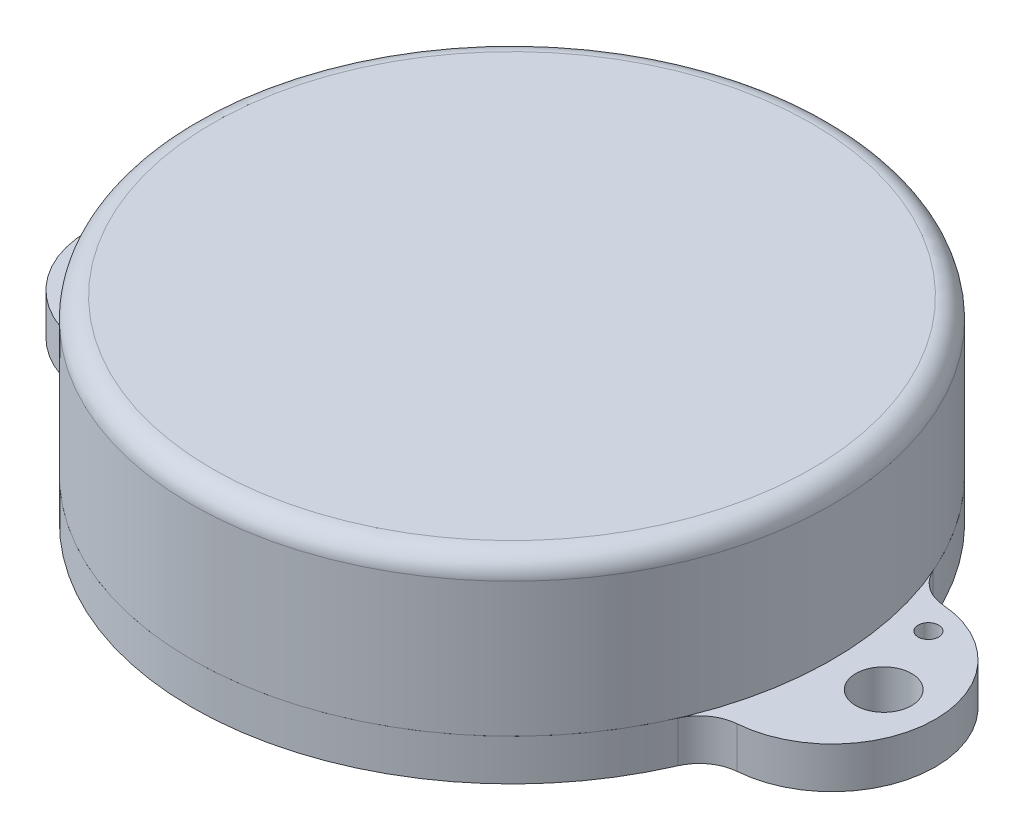
ISO-10303-21;
HEADER;
FILE_DESCRIPTION(('STEP AP214'),'2;1');
FILE_NAME('part.step','',(''),(''),'','','');
FILE_SCHEMA(('AUTOMOTIVE_DESIGN { 1 0 10303 214 1 1 1 1 }'));
ENDSEC;
DATA;
#1=APPLICATION_CONTEXT('core data for automotive mechanical design processes');
#2=APPLICATION_PROTOCOL_DEFINITION('international standard','automotive_design',2000,#1);
#3=PRODUCT_CONTEXT('',#1,'mechanical');
#4=PRODUCT('Part','Part','',(#3));
#5=PRODUCT_RELATED_PRODUCT_CATEGORY('part','',(#4));
#6=PRODUCT_DEFINITION_FORMATION('','',#4);
#7=PRODUCT_DEFINITION_CONTEXT('part definition',#1,'design');
#8=PRODUCT_DEFINITION('design','',#6,#7);
#9=PRODUCT_DEFINITION_SHAPE('','',#8);
#10=(LENGTH_UNIT() NAMED_UNIT(*) SI_UNIT(.MILLI.,.METRE.));
#11=(NAMED_UNIT(*) PLANE_ANGLE_UNIT() SI_UNIT($,.RADIAN.));
#12=(NAMED_UNIT(*) SI_UNIT($,.STERADIAN.) SOLID_ANGLE_UNIT());
#13=UNCERTAINTY_MEASURE_WITH_UNIT(LENGTH_MEASURE(1.E-05),#10,'distance_accuracy_value','');
#14=(GEOMETRIC_REPRESENTATION_CONTEXT(3) GLOBAL_UNCERTAINTY_ASSIGNED_CONTEXT((#13)) GLOBAL_UNIT_ASSIGNED_CONTEXT((#10,
#11,#12)) REPRESENTATION_CONTEXT('',''));
#15=CARTESIAN_POINT('',(0.,0.,0.));
#16=DIRECTION('',(0.,0.,1.));
#17=DIRECTION('',(1.,0.,0.));
#18=AXIS2_PLACEMENT_3D('',#15,#16,#17);
#19=CARTESIAN_POINT('',(0.,9.5,0.));
#20=DIRECTION('',(0.,-1.,0.));
#21=DIRECTION('',(0.,0.,-1.));
#22=AXIS2_PLACEMENT_3D('',#19,#20,#21);
#23=CYLINDRICAL_SURFACE('',#22,15.5);
#24=CARTESIAN_POINT('',(0.,8.5,0.));
#25=DIRECTION('',(0.,1.,0.));
#26=DIRECTION('',(0.,0.,1.));
#27=AXIS2_PLACEMENT_3D('',#24,#25,#26);
#28=CIRCLE('',#27,15.5);
#29=CARTESIAN_POINT('',(0.,8.5,15.5));
#30=VERTEX_POINT('',#29);
#31=EDGE_CURVE('E11',#30,#30,#28,.F.);
#32=ORIENTED_EDGE('',*,*,#31,.T.);
#33=EDGE_LOOP('',(#32));
#34=FACE_BOUND('',#33,.T.);
#35=CARTESIAN_POINT('',(0.,2.,0.));
#36=DIRECTION('',(0.,1.,0.));
#37=DIRECTION('',(0.,0.,1.));
#38=AXIS2_PLACEMENT_3D('',#35,#36,#37);
#39=CIRCLE('',#38,15.5);
#40=CARTESIAN_POINT('',(0.,2.,15.5));
#41=VERTEX_POINT('',#40);
#42=EDGE_CURVE('E53',#41,#41,#39,.T.);
#43=ORIENTED_EDGE('',*,*,#42,.T.);
#44=EDGE_LOOP('',(#43));
#45=FACE_BOUND('',#44,.T.);
#46=ADVANCED_FACE('F42',(#34,#45),#23,.T.);
#47=CARTESIAN_POINT('',(0.,9.5,0.));
#48=DIRECTION('',(0.,1.,0.));
#49=DIRECTION('',(0.,0.,1.));
#50=AXIS2_PLACEMENT_3D('',#47,#48,#49);
#51=PLANE('',#50);
#52=CARTESIAN_POINT('',(0.,9.5,0.));
#53=DIRECTION('',(0.,1.,0.));
#54=DIRECTION('',(0.,0.,1.));
#55=AXIS2_PLACEMENT_3D('',#52,#53,#54);
#56=CIRCLE('',#55,14.5);
#57=CARTESIAN_POINT('',(0.,9.5,14.5));
#58=VERTEX_POINT('',#57);
#59=EDGE_CURVE('E49',#58,#58,#56,.T.);
#60=ORIENTED_EDGE('',*,*,#59,.T.);
#61=EDGE_LOOP('',(#60));
#62=FACE_BOUND('',#61,.T.);
#63=ADVANCED_FACE('F63',(#62),#51,.T.);
#64=CARTESIAN_POINT('',(0.,2.,0.));
#65=DIRECTION('',(0.,1.,0.));
#66=DIRECTION('',(0.,0.,1.));
#67=AXIS2_PLACEMENT_3D('',#64,#65,#66);
#68=PLANE('',#67);
#69=ORIENTED_EDGE('',*,*,#42,.F.);
#70=EDGE_LOOP('',(#69));
#71=FACE_BOUND('',#70,.T.);
#72=ADVANCED_FACE('F61',(#71),#68,.F.);
#73=CARTESIAN_POINT('',(0.,8.5,0.));
#74=DIRECTION('',(0.,1.,0.));
#75=DIRECTION('',(0.,0.,1.));
#76=AXIS2_PLACEMENT_3D('',#73,#74,#75);
#77=TOROIDAL_SURFACE('',#76,14.5,1.);
#78=ORIENTED_EDGE('',*,*,#31,.F.);
#79=EDGE_LOOP('',(#78));
#80=FACE_BOUND('',#79,.T.);
#81=ORIENTED_EDGE('',*,*,#59,.F.);
#82=EDGE_LOOP('',(#81));
#83=FACE_BOUND('',#82,.T.);
#84=ADVANCED_FACE('F44',(#80,#83),#77,.T.);
#85=CLOSED_SHELL('',(#46,#63,#72,#84));
#86=MANIFOLD_SOLID_BREP('B2',#85);
#87=CARTESIAN_POINT('',(-8.0241935483871,2.,3.48924316980386));
#88=DIRECTION('',(0.,-1.,0.));
#89=DIRECTION('',(0.,0.,-1.));
#90=AXIS2_PLACEMENT_3D('',#87,#88,#89);
#91=PLANE('',#90);
#92=CARTESIAN_POINT('',(-16.0483870967742,2.,6.97848633960772));
#93=DIRECTION('',(0.,-1.,0.));
#94=DIRECTION('',(0.,0.,-1.));
#95=AXIS2_PLACEMENT_3D('',#92,#93,#94);
#96=CIRCLE('',#95,2.);
#97=CARTESIAN_POINT('',(-15.8917050691244,2.,4.9846330997198));
#98=VERTEX_POINT('',#97);
#99=CARTESIAN_POINT('',(-14.2142857142857,2.,6.18094504365255));
#100=VERTEX_POINT('',#99);
#101=EDGE_CURVE('E209',#98,#100,#96,.T.);
#102=ORIENTED_EDGE('',*,*,#101,.T.);
#103=CARTESIAN_POINT('',(0.,2.,0.));
#104=DIRECTION('',(0.,1.,0.));
#105=DIRECTION('',(0.,0.,1.));
#106=AXIS2_PLACEMENT_3D('',#103,#104,#105);
#107=CIRCLE('',#106,15.5);
#108=CARTESIAN_POINT('',(14.2142857142857,2.,6.18094504365255));
#109=VERTEX_POINT('',#108);
#110=EDGE_CURVE('E157',#100,#109,#107,.T.);
#111=ORIENTED_EDGE('',*,*,#110,.T.);
#112=CARTESIAN_POINT('',(16.0483870967742,2.,6.97848633960772));
#113=DIRECTION('',(0.,-1.,0.));
#114=DIRECTION('',(0.,0.,1.));
#115=AXIS2_PLACEMENT_3D('',#112,#113,#114);
#116=CIRCLE('',#115,2.);
#117=CARTESIAN_POINT('',(15.8917050691244,2.,4.9846330997198));
#118=VERTEX_POINT('',#117);
#119=EDGE_CURVE('E224',#109,#118,#116,.T.);
#120=ORIENTED_EDGE('',*,*,#119,.T.);
#121=CARTESIAN_POINT('',(15.5,2.,0.));
#122=DIRECTION('',(0.,1.,0.));
#123=DIRECTION('',(0.,0.,1.));
#124=AXIS2_PLACEMENT_3D('',#121,#122,#123);
#125=CIRCLE('',#124,5.);
#126=CARTESIAN_POINT('',(15.8917050691244,2.,-4.9846330997198));
#127=VERTEX_POINT('',#126);
#128=EDGE_CURVE('E237',#118,#127,#125,.T.);
#129=ORIENTED_EDGE('',*,*,#128,.T.);
#130=CARTESIAN_POINT('',(16.0483870967742,2.,-6.97848633960772));
#131=DIRECTION('',(0.,-1.,0.));
#132=DIRECTION('',(0.,0.,-1.));
#133=AXIS2_PLACEMENT_3D('',#130,#131,#132);
#134=CIRCLE('',#133,2.);
#135=CARTESIAN_POINT('',(14.2142857142857,2.,-6.18094504365255));
#136=VERTEX_POINT('',#135);
#137=EDGE_CURVE('E176',#127,#136,#134,.T.);
#138=ORIENTED_EDGE('',*,*,#137,.T.);
#139=CARTESIAN_POINT('',(0.,2.,0.));
#140=DIRECTION('',(0.,1.,0.));
#141=DIRECTION('',(0.,0.,1.));
#142=AXIS2_PLACEMENT_3D('',#139,#140,#141);
#143=CIRCLE('',#142,15.5);
#144=CARTESIAN_POINT('',(-14.2142857142857,2.,-6.18094504365255));
#145=VERTEX_POINT('',#144);
#146=EDGE_CURVE('E170',#136,#145,#143,.T.);
#147=ORIENTED_EDGE('',*,*,#146,.T.);
#148=CARTESIAN_POINT('',(-16.0483870967742,2.,-6.97848633960772));
#149=DIRECTION('',(0.,-1.,0.));
#150=DIRECTION('',(0.,0.,1.));
#151=AXIS2_PLACEMENT_3D('',#148,#149,#150);
#152=CIRCLE('',#151,2.);
#153=CARTESIAN_POINT('',(-15.8917050691244,2.,-4.9846330997198));
#154=VERTEX_POINT('',#153);
#155=EDGE_CURVE('E174',#145,#154,#152,.T.);
#156=ORIENTED_EDGE('',*,*,#155,.T.);
#157=CARTESIAN_POINT('',(-15.5,2.,0.));
#158=DIRECTION('',(0.,1.,0.));
#159=DIRECTION('',(0.,0.,1.));
#160=AXIS2_PLACEMENT_3D('',#157,#158,#159);
#161=CIRCLE('',#160,5.);
#162=EDGE_CURVE('E114',#154,#98,#161,.T.);
#163=ORIENTED_EDGE('',*,*,#162,.T.);
#164=EDGE_LOOP('',(#102,#111,#120,#129,#138,#147,#156,#163));
#165=FACE_BOUND('',#164,.T.);
#166=CARTESIAN_POINT('',(-18.,2.,0.));
#167=DIRECTION('',(0.,1.,0.));
#168=DIRECTION('',(0.,0.,1.));
#169=AXIS2_PLACEMENT_3D('',#166,#167,#168);
#170=CIRCLE('',#169,1.35);
#171=CARTESIAN_POINT('',(-18.,2.,1.35));
#172=VERTEX_POINT('',#171);
#173=EDGE_CURVE('E198',#172,#172,#170,.T.);
#174=ORIENTED_EDGE('',*,*,#173,.F.);
#175=EDGE_LOOP('',(#174));
#176=FACE_BOUND('',#175,.T.);
#177=CARTESIAN_POINT('',(18.,2.,0.));
#178=DIRECTION('',(0.,1.,0.));
#179=DIRECTION('',(0.,0.,1.));
#180=AXIS2_PLACEMENT_3D('',#177,#178,#179);
#181=CIRCLE('',#180,1.35);
#182=CARTESIAN_POINT('',(18.,2.,1.35));
#183=VERTEX_POINT('',#182);
#184=EDGE_CURVE('E246',#183,#183,#181,.T.);
#185=ORIENTED_EDGE('',*,*,#184,.F.);
#186=EDGE_LOOP('',(#185));
#187=FACE_BOUND('',#186,.T.);
#188=CARTESIAN_POINT('',(16.6285092124747,2.,-3.53449874390192));
#189=DIRECTION('',(0.,1.,0.));
#190=DIRECTION('',(0.,0.,1.));
#191=AXIS2_PLACEMENT_3D('',#188,#189,#190);
#192=CIRCLE('',#191,0.499999999999999);
#193=CARTESIAN_POINT('',(16.6285092124747,2.,-3.03449874390192));
#194=VERTEX_POINT('',#193);
#195=EDGE_CURVE('E252',#194,#194,#192,.T.);
#196=ORIENTED_EDGE('',*,*,#195,.F.);
#197=EDGE_LOOP('',(#196));
#198=FACE_BOUND('',#197,.T.);
#199=CARTESIAN_POINT('',(-16.6285092124747,2.,3.53449874390192));
#200=DIRECTION('',(0.,1.,0.));
#201=DIRECTION('',(0.,0.,1.));
#202=AXIS2_PLACEMENT_3D('',#199,#200,#201);
#203=CIRCLE('',#202,0.499999999999999);
#204=CARTESIAN_POINT('',(-16.6285092124747,2.,4.03449874390192));
#205=VERTEX_POINT('',#204);
#206=EDGE_CURVE('E258',#205,#205,#203,.T.);
#207=ORIENTED_EDGE('',*,*,#206,.F.);
#208=EDGE_LOOP('',(#207));
#209=FACE_BOUND('',#208,.T.);
#210=ADVANCED_FACE('F97',(#165,#176,#187,#198,#209),#91,.F.);
#211=CARTESIAN_POINT('',(-8.0241935483871,0.,3.48924316980386));
#212=DIRECTION('',(0.,-1.,0.));
#213=DIRECTION('',(0.,0.,-1.));
#214=AXIS2_PLACEMENT_3D('',#211,#212,#213);
#215=PLANE('',#214);
#216=CARTESIAN_POINT('',(16.6285092124747,0.,-3.53449874390192));
#217=DIRECTION('',(0.,1.,0.));
#218=DIRECTION('',(0.,0.,1.));
#219=AXIS2_PLACEMENT_3D('',#216,#217,#218);
#220=CIRCLE('',#219,0.499999999999999);
#221=CARTESIAN_POINT('',(16.6285092124747,0.,-3.03449874390192));
#222=VERTEX_POINT('',#221);
#223=EDGE_CURVE('E255',#222,#222,#220,.T.);
#224=ORIENTED_EDGE('',*,*,#223,.T.);
#225=EDGE_LOOP('',(#224));
#226=FACE_BOUND('',#225,.T.);
#227=CARTESIAN_POINT('',(-18.,0.,0.));
#228=DIRECTION('',(0.,1.,0.));
#229=DIRECTION('',(0.,0.,1.));
#230=AXIS2_PLACEMENT_3D('',#227,#228,#229);
#231=CIRCLE('',#230,1.35);
#232=CARTESIAN_POINT('',(-18.,0.,1.35));
#233=VERTEX_POINT('',#232);
#234=EDGE_CURVE('E243',#233,#233,#231,.T.);
#235=ORIENTED_EDGE('',*,*,#234,.T.);
#236=EDGE_LOOP('',(#235));
#237=FACE_BOUND('',#236,.T.);
#238=CARTESIAN_POINT('',(-16.0483870967742,0.,6.97848633960772));
#239=DIRECTION('',(0.,-1.,0.));
#240=DIRECTION('',(0.,0.,-1.));
#241=AXIS2_PLACEMENT_3D('',#238,#239,#240);
#242=CIRCLE('',#241,2.);
#243=CARTESIAN_POINT('',(-15.8917050691244,0.,4.9846330997198));
#244=VERTEX_POINT('',#243);
#245=CARTESIAN_POINT('',(-14.2142857142857,0.,6.18094504365255));
#246=VERTEX_POINT('',#245);
#247=EDGE_CURVE('E194',#244,#246,#242,.T.);
#248=ORIENTED_EDGE('',*,*,#247,.F.);
#249=CARTESIAN_POINT('',(-15.5,0.,0.));
#250=DIRECTION('',(0.,1.,0.));
#251=DIRECTION('',(0.,0.,1.));
#252=AXIS2_PLACEMENT_3D('',#249,#250,#251);
#253=CIRCLE('',#252,5.);
#254=CARTESIAN_POINT('',(-15.8917050691244,0.,-4.9846330997198));
#255=VERTEX_POINT('',#254);
#256=EDGE_CURVE('E149',#255,#244,#253,.T.);
#257=ORIENTED_EDGE('',*,*,#256,.F.);
#258=CARTESIAN_POINT('',(-16.0483870967742,0.,-6.97848633960772));
#259=DIRECTION('',(0.,-1.,0.));
#260=DIRECTION('',(0.,0.,1.));
#261=AXIS2_PLACEMENT_3D('',#258,#259,#260);
#262=CIRCLE('',#261,2.);
#263=CARTESIAN_POINT('',(-14.2142857142857,0.,-6.18094504365255));
#264=VERTEX_POINT('',#263);
#265=EDGE_CURVE('E143',#264,#255,#262,.T.);
#266=ORIENTED_EDGE('',*,*,#265,.F.);
#267=CARTESIAN_POINT('',(0.,0.,0.));
#268=DIRECTION('',(0.,1.,0.));
#269=DIRECTION('',(0.,0.,1.));
#270=AXIS2_PLACEMENT_3D('',#267,#268,#269);
#271=CIRCLE('',#270,15.5);
#272=CARTESIAN_POINT('',(14.2142857142857,0.,-6.18094504365255));
#273=VERTEX_POINT('',#272);
#274=EDGE_CURVE('E184',#273,#264,#271,.T.);
#275=ORIENTED_EDGE('',*,*,#274,.F.);
#276=CARTESIAN_POINT('',(16.0483870967742,0.,-6.97848633960772));
#277=DIRECTION('',(0.,-1.,0.));
#278=DIRECTION('',(0.,0.,-1.));
#279=AXIS2_PLACEMENT_3D('',#276,#277,#278);
#280=CIRCLE('',#279,2.);
#281=CARTESIAN_POINT('',(15.8917050691244,0.,-4.9846330997198));
#282=VERTEX_POINT('',#281);
#283=EDGE_CURVE('E204',#282,#273,#280,.T.);
#284=ORIENTED_EDGE('',*,*,#283,.F.);
#285=CARTESIAN_POINT('',(15.5,0.,0.));
#286=DIRECTION('',(0.,1.,0.));
#287=DIRECTION('',(0.,0.,1.));
#288=AXIS2_PLACEMENT_3D('',#285,#286,#287);
#289=CIRCLE('',#288,5.);
#290=CARTESIAN_POINT('',(15.8917050691244,0.,4.9846330997198));
#291=VERTEX_POINT('',#290);
#292=EDGE_CURVE('E202',#291,#282,#289,.T.);
#293=ORIENTED_EDGE('',*,*,#292,.F.);
#294=CARTESIAN_POINT('',(16.0483870967742,0.,6.97848633960772));
#295=DIRECTION('',(0.,-1.,0.));
#296=DIRECTION('',(0.,0.,1.));
#297=AXIS2_PLACEMENT_3D('',#294,#295,#296);
#298=CIRCLE('',#297,2.);
#299=CARTESIAN_POINT('',(14.2142857142857,0.,6.18094504365255));
#300=VERTEX_POINT('',#299);
#301=EDGE_CURVE('E200',#300,#291,#298,.T.);
#302=ORIENTED_EDGE('',*,*,#301,.F.);
#303=CARTESIAN_POINT('',(0.,0.,0.));
#304=DIRECTION('',(0.,1.,0.));
#305=DIRECTION('',(0.,0.,1.));
#306=AXIS2_PLACEMENT_3D('',#303,#304,#305);
#307=CIRCLE('',#306,15.5);
#308=EDGE_CURVE('E197',#246,#300,#307,.T.);
#309=ORIENTED_EDGE('',*,*,#308,.F.);
#310=EDGE_LOOP('',(#248,#257,#266,#275,#284,#293,#302,#309));
#311=FACE_BOUND('',#310,.T.);
#312=CARTESIAN_POINT('',(18.,0.,0.));
#313=DIRECTION('',(0.,1.,0.));
#314=DIRECTION('',(0.,0.,1.));
#315=AXIS2_PLACEMENT_3D('',#312,#313,#314);
#316=CIRCLE('',#315,1.35);
#317=CARTESIAN_POINT('',(18.,0.,1.35));
#318=VERTEX_POINT('',#317);
#319=EDGE_CURVE('E249',#318,#318,#316,.T.);
#320=ORIENTED_EDGE('',*,*,#319,.T.);
#321=EDGE_LOOP('',(#320));
#322=FACE_BOUND('',#321,.T.);
#323=CARTESIAN_POINT('',(-16.6285092124747,0.,3.53449874390192));
#324=DIRECTION('',(0.,1.,0.));
#325=DIRECTION('',(0.,0.,1.));
#326=AXIS2_PLACEMENT_3D('',#323,#324,#325);
#327=CIRCLE('',#326,0.499999999999999);
#328=CARTESIAN_POINT('',(-16.6285092124747,0.,4.03449874390192));
#329=VERTEX_POINT('',#328);
#330=EDGE_CURVE('E261',#329,#329,#327,.T.);
#331=ORIENTED_EDGE('',*,*,#330,.T.);
#332=EDGE_LOOP('',(#331));
#333=FACE_BOUND('',#332,.T.);
#334=ADVANCED_FACE('F228',(#226,#237,#311,#322,#333),#215,.T.);
#335=CARTESIAN_POINT('',(-16.0483870967742,2.,6.97848633960772));
#336=DIRECTION('',(0.,-1.,0.));
#337=DIRECTION('',(0.,0.,-1.));
#338=AXIS2_PLACEMENT_3D('',#335,#336,#337);
#339=CYLINDRICAL_SURFACE('',#338,2.);
#340=ORIENTED_EDGE('',*,*,#247,.T.);
#341=DIRECTION('',(0.,-1.,0.));
#342=VECTOR('',#341,1.);
#343=CARTESIAN_POINT('',(-14.2142857142857,2.,6.18094504365255));
#344=LINE('',#343,#342);
#345=EDGE_CURVE('E40',#100,#246,#344,.T.);
#346=ORIENTED_EDGE('',*,*,#345,.F.);
#347=ORIENTED_EDGE('',*,*,#101,.F.);
#348=DIRECTION('',(0.,-1.,0.));
#349=VECTOR('',#348,1.);
#350=CARTESIAN_POINT('',(-15.8917050691244,2.,4.9846330997198));
#351=LINE('',#350,#349);
#352=EDGE_CURVE('E190',#98,#244,#351,.T.);
#353=ORIENTED_EDGE('',*,*,#352,.T.);
#354=EDGE_LOOP('',(#340,#346,#347,#353));
#355=FACE_BOUND('',#354,.T.);
#356=ADVANCED_FACE('F99',(#355),#339,.F.);
#357=CARTESIAN_POINT('',(0.,2.,0.));
#358=DIRECTION('',(0.,-1.,0.));
#359=DIRECTION('',(0.,0.,-1.));
#360=AXIS2_PLACEMENT_3D('',#357,#358,#359);
#361=CYLINDRICAL_SURFACE('',#360,15.5);
#362=ORIENTED_EDGE('',*,*,#308,.T.);
#363=DIRECTION('',(0.,-1.,0.));
#364=VECTOR('',#363,1.);
#365=CARTESIAN_POINT('',(14.2142857142857,2.,6.18094504365255));
#366=LINE('',#365,#364);
#367=EDGE_CURVE('E106',#109,#300,#366,.T.);
#368=ORIENTED_EDGE('',*,*,#367,.F.);
#369=ORIENTED_EDGE('',*,*,#110,.F.);
#370=ORIENTED_EDGE('',*,*,#345,.T.);
#371=EDGE_LOOP('',(#362,#368,#369,#370));
#372=FACE_BOUND('',#371,.T.);
#373=ADVANCED_FACE('F293',(#372),#361,.T.);
#374=CARTESIAN_POINT('',(16.0483870967742,2.,6.97848633960772));
#375=DIRECTION('',(0.,-1.,0.));
#376=DIRECTION('',(0.,0.,-1.));
#377=AXIS2_PLACEMENT_3D('',#374,#375,#376);
#378=CYLINDRICAL_SURFACE('',#377,2.);
#379=ORIENTED_EDGE('',*,*,#301,.T.);
#380=DIRECTION('',(0.,-1.,0.));
#381=VECTOR('',#380,1.);
#382=CARTESIAN_POINT('',(15.8917050691244,2.,4.9846330997198));
#383=LINE('',#382,#381);
#384=EDGE_CURVE('E216',#118,#291,#383,.T.);
#385=ORIENTED_EDGE('',*,*,#384,.F.);
#386=ORIENTED_EDGE('',*,*,#119,.F.);
#387=ORIENTED_EDGE('',*,*,#367,.T.);
#388=EDGE_LOOP('',(#379,#385,#386,#387));
#389=FACE_BOUND('',#388,.T.);
#390=ADVANCED_FACE('F222',(#389),#378,.F.);
#391=CARTESIAN_POINT('',(15.5,2.,0.));
#392=DIRECTION('',(0.,-1.,0.));
#393=DIRECTION('',(0.,0.,-1.));
#394=AXIS2_PLACEMENT_3D('',#391,#392,#393);
#395=CYLINDRICAL_SURFACE('',#394,5.);
#396=ORIENTED_EDGE('',*,*,#292,.T.);
#397=DIRECTION('',(0.,-1.,0.));
#398=VECTOR('',#397,1.);
#399=CARTESIAN_POINT('',(15.8917050691244,2.,-4.9846330997198));
#400=LINE('',#399,#398);
#401=EDGE_CURVE('E213',#127,#282,#400,.T.);
#402=ORIENTED_EDGE('',*,*,#401,.F.);
#403=ORIENTED_EDGE('',*,*,#128,.F.);
#404=ORIENTED_EDGE('',*,*,#384,.T.);
#405=EDGE_LOOP('',(#396,#402,#403,#404));
#406=FACE_BOUND('',#405,.T.);
#407=ADVANCED_FACE('F233',(#406),#395,.T.);
#408=CARTESIAN_POINT('',(16.0483870967742,2.,-6.97848633960772));
#409=DIRECTION('',(0.,-1.,0.));
#410=DIRECTION('',(0.,0.,-1.));
#411=AXIS2_PLACEMENT_3D('',#408,#409,#410);
#412=CYLINDRICAL_SURFACE('',#411,2.);
#413=ORIENTED_EDGE('',*,*,#283,.T.);
#414=DIRECTION('',(0.,-1.,0.));
#415=VECTOR('',#414,1.);
#416=CARTESIAN_POINT('',(14.2142857142857,2.,-6.18094504365255));
#417=LINE('',#416,#415);
#418=EDGE_CURVE('E185',#136,#273,#417,.T.);
#419=ORIENTED_EDGE('',*,*,#418,.F.);
#420=ORIENTED_EDGE('',*,*,#137,.F.);
#421=ORIENTED_EDGE('',*,*,#401,.T.);
#422=EDGE_LOOP('',(#413,#419,#420,#421));
#423=FACE_BOUND('',#422,.T.);
#424=ADVANCED_FACE('F236',(#423),#412,.F.);
#425=CARTESIAN_POINT('',(0.,2.,0.));
#426=DIRECTION('',(0.,-1.,0.));
#427=DIRECTION('',(0.,0.,-1.));
#428=AXIS2_PLACEMENT_3D('',#425,#426,#427);
#429=CYLINDRICAL_SURFACE('',#428,15.5);
#430=ORIENTED_EDGE('',*,*,#274,.T.);
#431=DIRECTION('',(0.,-1.,0.));
#432=VECTOR('',#431,1.);
#433=CARTESIAN_POINT('',(-14.2142857142857,2.,-6.18094504365255));
#434=LINE('',#433,#432);
#435=EDGE_CURVE('E181',#145,#264,#434,.T.);
#436=ORIENTED_EDGE('',*,*,#435,.F.);
#437=ORIENTED_EDGE('',*,*,#146,.F.);
#438=ORIENTED_EDGE('',*,*,#418,.T.);
#439=EDGE_LOOP('',(#430,#436,#437,#438));
#440=FACE_BOUND('',#439,.T.);
#441=ADVANCED_FACE('F182',(#440),#429,.T.);
#442=CARTESIAN_POINT('',(-16.0483870967742,2.,-6.97848633960772));
#443=DIRECTION('',(0.,-1.,0.));
#444=DIRECTION('',(0.,0.,-1.));
#445=AXIS2_PLACEMENT_3D('',#442,#443,#444);
#446=CYLINDRICAL_SURFACE('',#445,2.);
#447=ORIENTED_EDGE('',*,*,#265,.T.);
#448=DIRECTION('',(0.,-1.,0.));
#449=VECTOR('',#448,1.);
#450=CARTESIAN_POINT('',(-15.8917050691244,2.,-4.9846330997198));
#451=LINE('',#450,#449);
#452=EDGE_CURVE('E186',#154,#255,#451,.T.);
#453=ORIENTED_EDGE('',*,*,#452,.F.);
#454=ORIENTED_EDGE('',*,*,#155,.F.);
#455=ORIENTED_EDGE('',*,*,#435,.T.);
#456=EDGE_LOOP('',(#447,#453,#454,#455));
#457=FACE_BOUND('',#456,.T.);
#458=ADVANCED_FACE('F188',(#457),#446,.F.);
#459=CARTESIAN_POINT('',(-15.5,2.,0.));
#460=DIRECTION('',(0.,-1.,0.));
#461=DIRECTION('',(0.,0.,-1.));
#462=AXIS2_PLACEMENT_3D('',#459,#460,#461);
#463=CYLINDRICAL_SURFACE('',#462,5.);
#464=ORIENTED_EDGE('',*,*,#256,.T.);
#465=ORIENTED_EDGE('',*,*,#352,.F.);
#466=ORIENTED_EDGE('',*,*,#162,.F.);
#467=ORIENTED_EDGE('',*,*,#452,.T.);
#468=EDGE_LOOP('',(#464,#465,#466,#467));
#469=FACE_BOUND('',#468,.T.);
#470=ADVANCED_FACE('F281',(#469),#463,.T.);
#471=CARTESIAN_POINT('',(-18.,2.,0.));
#472=DIRECTION('',(0.,-1.,0.));
#473=DIRECTION('',(0.,0.,-1.));
#474=AXIS2_PLACEMENT_3D('',#471,#472,#473);
#475=CYLINDRICAL_SURFACE('',#474,1.35);
#476=ORIENTED_EDGE('',*,*,#173,.T.);
#477=EDGE_LOOP('',(#476));
#478=FACE_BOUND('',#477,.T.);
#479=ORIENTED_EDGE('',*,*,#234,.F.);
#480=EDGE_LOOP('',(#479));
#481=FACE_BOUND('',#480,.T.);
#482=ADVANCED_FACE('F278',(#478,#481),#475,.F.);
#483=CARTESIAN_POINT('',(18.,2.,0.));
#484=DIRECTION('',(0.,-1.,0.));
#485=DIRECTION('',(0.,0.,-1.));
#486=AXIS2_PLACEMENT_3D('',#483,#484,#485);
#487=CYLINDRICAL_SURFACE('',#486,1.35);
#488=ORIENTED_EDGE('',*,*,#184,.T.);
#489=EDGE_LOOP('',(#488));
#490=FACE_BOUND('',#489,.T.);
#491=ORIENTED_EDGE('',*,*,#319,.F.);
#492=EDGE_LOOP('',(#491));
#493=FACE_BOUND('',#492,.T.);
#494=ADVANCED_FACE('F357',(#490,#493),#487,.F.);
#495=CARTESIAN_POINT('',(16.6285092124747,2.,-3.53449874390192));
#496=DIRECTION('',(0.,-1.,0.));
#497=DIRECTION('',(0.,0.,-1.));
#498=AXIS2_PLACEMENT_3D('',#495,#496,#497);
#499=CYLINDRICAL_SURFACE('',#498,0.499999999999999);
#500=ORIENTED_EDGE('',*,*,#195,.T.);
#501=EDGE_LOOP('',(#500));
#502=FACE_BOUND('',#501,.T.);
#503=ORIENTED_EDGE('',*,*,#223,.F.);
#504=EDGE_LOOP('',(#503));
#505=FACE_BOUND('',#504,.T.);
#506=ADVANCED_FACE('F365',(#502,#505),#499,.F.);
#507=CARTESIAN_POINT('',(-16.6285092124747,2.,3.53449874390192));
#508=DIRECTION('',(0.,-1.,0.));
#509=DIRECTION('',(0.,0.,-1.));
#510=AXIS2_PLACEMENT_3D('',#507,#508,#509);
#511=CYLINDRICAL_SURFACE('',#510,0.499999999999999);
#512=ORIENTED_EDGE('',*,*,#206,.T.);
#513=EDGE_LOOP('',(#512));
#514=FACE_BOUND('',#513,.T.);
#515=ORIENTED_EDGE('',*,*,#330,.F.);
#516=EDGE_LOOP('',(#515));
#517=FACE_BOUND('',#516,.T.);
#518=ADVANCED_FACE('F267',(#514,#517),#511,.F.);
#519=CLOSED_SHELL('',(#210,#334,#356,#373,#390,#407,#424,#441,#458,#470,#482,#494,#506,#518));
#520=MANIFOLD_SOLID_BREP('B6',#519);
#521=ADVANCED_BREP_SHAPE_REPRESENTATION('',(#18,#86,#520),#14);
#522=SHAPE_DEFINITION_REPRESENTATION(#9,#521);
ENDSEC;
END-ISO-10303-21;
